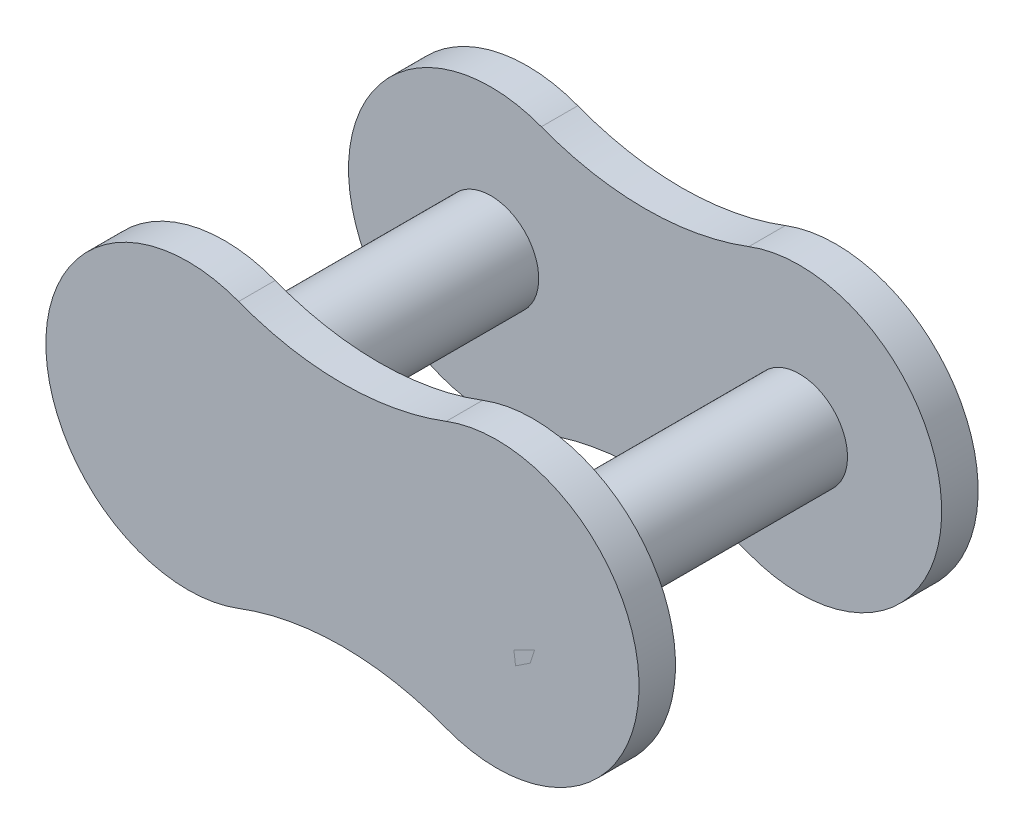
ISO-10303-21;
HEADER;
FILE_DESCRIPTION(('STEP AP214'),'2;1');
FILE_NAME('part.step','',(''),(''),'','','');
FILE_SCHEMA(('AUTOMOTIVE_DESIGN { 1 0 10303 214 1 1 1 1 }'));
ENDSEC;
DATA;
#1=APPLICATION_CONTEXT('core data for automotive mechanical design processes');
#2=APPLICATION_PROTOCOL_DEFINITION('international standard','automotive_design',2000,#1);
#3=PRODUCT_CONTEXT('',#1,'mechanical');
#4=PRODUCT('Part','Part','',(#3));
#5=PRODUCT_RELATED_PRODUCT_CATEGORY('part','',(#4));
#6=PRODUCT_DEFINITION_FORMATION('','',#4);
#7=PRODUCT_DEFINITION_CONTEXT('part definition',#1,'design');
#8=PRODUCT_DEFINITION('design','',#6,#7);
#9=PRODUCT_DEFINITION_SHAPE('','',#8);
#10=(LENGTH_UNIT() NAMED_UNIT(*) SI_UNIT(.MILLI.,.METRE.));
#11=(NAMED_UNIT(*) PLANE_ANGLE_UNIT() SI_UNIT($,.RADIAN.));
#12=(NAMED_UNIT(*) SI_UNIT($,.STERADIAN.) SOLID_ANGLE_UNIT());
#13=UNCERTAINTY_MEASURE_WITH_UNIT(LENGTH_MEASURE(1.E-05),#10,'distance_accuracy_value','');
#14=(GEOMETRIC_REPRESENTATION_CONTEXT(3) GLOBAL_UNCERTAINTY_ASSIGNED_CONTEXT((#13)) GLOBAL_UNIT_ASSIGNED_CONTEXT((#10,
#11,#12)) REPRESENTATION_CONTEXT('',''));
#15=CARTESIAN_POINT('',(0.,0.,0.));
#16=DIRECTION('',(0.,0.,1.));
#17=DIRECTION('',(1.,0.,0.));
#18=AXIS2_PLACEMENT_3D('',#15,#16,#17);
#19=CARTESIAN_POINT('',(12.7,0.,19.5361435713737));
#20=DIRECTION('',(0.,0.,-1.));
#21=DIRECTION('',(-1.,0.,0.));
#22=AXIS2_PLACEMENT_3D('',#19,#20,#21);
#23=CYLINDRICAL_SURFACE('',#22,1.975);
#24=CARTESIAN_POINT('',(12.7,0.,13.95));
#25=DIRECTION('',(0.,0.,-1.));
#26=DIRECTION('',(-1.,0.,0.));
#27=AXIS2_PLACEMENT_3D('',#24,#25,#26);
#28=CIRCLE('',#27,1.975);
#29=CARTESIAN_POINT('',(10.725,0.,13.95));
#30=VERTEX_POINT('',#29);
#31=EDGE_CURVE('E11',#30,#30,#28,.F.);
#32=ORIENTED_EDGE('',*,*,#31,.F.);
#33=EDGE_LOOP('',(#32));
#34=FACE_BOUND('',#33,.T.);
#35=CARTESIAN_POINT('',(12.7,0.,0.));
#36=DIRECTION('',(0.,0.,-1.));
#37=DIRECTION('',(-1.,0.,0.));
#38=AXIS2_PLACEMENT_3D('',#35,#36,#37);
#39=CIRCLE('',#38,1.975);
#40=CARTESIAN_POINT('',(10.725,0.,0.));
#41=VERTEX_POINT('',#40);
#42=EDGE_CURVE('E45',#41,#41,#39,.T.);
#43=ORIENTED_EDGE('',*,*,#42,.F.);
#44=EDGE_LOOP('',(#43));
#45=FACE_BOUND('',#44,.T.);
#46=ADVANCED_FACE('F39',(#34,#45),#23,.T.);
#47=CARTESIAN_POINT('',(12.7,0.,0.));
#48=DIRECTION('',(0.,0.,-1.));
#49=DIRECTION('',(-1.,0.,0.));
#50=AXIS2_PLACEMENT_3D('',#47,#48,#49);
#51=PLANE('',#50);
#52=ORIENTED_EDGE('',*,*,#42,.T.);
#53=EDGE_LOOP('',(#52));
#54=FACE_BOUND('',#53,.T.);
#55=ADVANCED_FACE('F51',(#54),#51,.T.);
#56=CARTESIAN_POINT('',(9.525,8.3411629884567,13.95));
#57=DIRECTION('',(0.,0.,-1.));
#58=DIRECTION('',(1.,0.,0.));
#59=AXIS2_PLACEMENT_3D('',#56,#57,#58);
#60=PLANE('',#59);
#61=ORIENTED_EDGE('',*,*,#31,.T.);
#62=EDGE_LOOP('',(#61));
#63=FACE_BOUND('',#62,.T.);
#64=ADVANCED_FACE('F58',(#63),#60,.F.);
#65=CLOSED_SHELL('',(#46,#55,#64));
#66=MANIFOLD_SOLID_BREP('B2',#65);
#67=CARTESIAN_POINT('',(0.,0.,19.5361435713737));
#68=DIRECTION('',(0.,0.,-1.));
#69=DIRECTION('',(-1.,0.,0.));
#70=AXIS2_PLACEMENT_3D('',#67,#68,#69);
#71=CYLINDRICAL_SURFACE('',#70,1.975);
#72=CARTESIAN_POINT('',(0.,0.,13.95));
#73=DIRECTION('',(0.,0.,-1.));
#74=DIRECTION('',(-1.,0.,0.));
#75=AXIS2_PLACEMENT_3D('',#72,#73,#74);
#76=CIRCLE('',#75,1.975);
#77=CARTESIAN_POINT('',(-1.975,0.,13.95));
#78=VERTEX_POINT('',#77);
#79=EDGE_CURVE('E38',#78,#78,#76,.F.);
#80=ORIENTED_EDGE('',*,*,#79,.F.);
#81=EDGE_LOOP('',(#80));
#82=FACE_BOUND('',#81,.T.);
#83=CARTESIAN_POINT('',(0.,0.,0.));
#84=DIRECTION('',(0.,0.,-1.));
#85=DIRECTION('',(-1.,0.,0.));
#86=AXIS2_PLACEMENT_3D('',#83,#84,#85);
#87=CIRCLE('',#86,1.975);
#88=CARTESIAN_POINT('',(-1.975,0.,0.));
#89=VERTEX_POINT('',#88);
#90=EDGE_CURVE('E95',#89,#89,#87,.T.);
#91=ORIENTED_EDGE('',*,*,#90,.F.);
#92=EDGE_LOOP('',(#91));
#93=FACE_BOUND('',#92,.T.);
#94=ADVANCED_FACE('F89',(#82,#93),#71,.T.);
#95=CARTESIAN_POINT('',(0.,0.,0.));
#96=DIRECTION('',(0.,0.,-1.));
#97=DIRECTION('',(-1.,0.,0.));
#98=AXIS2_PLACEMENT_3D('',#95,#96,#97);
#99=PLANE('',#98);
#100=ORIENTED_EDGE('',*,*,#90,.T.);
#101=EDGE_LOOP('',(#100));
#102=FACE_BOUND('',#101,.T.);
#103=ADVANCED_FACE('F101',(#102),#99,.T.);
#104=CARTESIAN_POINT('',(9.525,8.3411629884567,13.95));
#105=DIRECTION('',(0.,0.,-1.));
#106=DIRECTION('',(1.,0.,0.));
#107=AXIS2_PLACEMENT_3D('',#104,#105,#106);
#108=PLANE('',#107);
#109=ORIENTED_EDGE('',*,*,#79,.T.);
#110=EDGE_LOOP('',(#109));
#111=FACE_BOUND('',#110,.T.);
#112=ADVANCED_FACE('F108',(#111),#108,.F.);
#113=CLOSED_SHELL('',(#94,#103,#112));
#114=MANIFOLD_SOLID_BREP('B6',#113);
#115=CARTESIAN_POINT('',(6.35,16.6823259769134,12.45));
#116=DIRECTION('',(0.,0.,1.));
#117=DIRECTION('',(-1.,0.,0.));
#118=AXIS2_PLACEMENT_3D('',#115,#116,#117);
#119=CYLINDRICAL_SURFACE('',#118,12.);
#120=CARTESIAN_POINT('',(6.35,16.6823259769134,13.95));
#121=DIRECTION('',(0.,0.,-1.));
#122=DIRECTION('',(1.,0.,0.));
#123=AXIS2_PLACEMENT_3D('',#120,#121,#122);
#124=CIRCLE('',#123,12.);
#125=CARTESIAN_POINT('',(10.6189075630252,5.46731691680355,13.95));
#126=VERTEX_POINT('',#125);
#127=CARTESIAN_POINT('',(2.08109243697479,5.46731691680355,13.95));
#128=VERTEX_POINT('',#127);
#129=EDGE_CURVE('E201',#126,#128,#124,.T.);
#130=ORIENTED_EDGE('',*,*,#129,.F.);
#131=DIRECTION('',(0.,0.,1.));
#132=VECTOR('',#131,1.);
#133=CARTESIAN_POINT('',(10.6189075630252,5.46731691680355,12.45));
#134=LINE('',#133,#132);
#135=CARTESIAN_POINT('',(10.6189075630252,5.46731691680355,12.45));
#136=VERTEX_POINT('',#135);
#137=EDGE_CURVE('E200',#136,#126,#134,.T.);
#138=ORIENTED_EDGE('',*,*,#137,.F.);
#139=CARTESIAN_POINT('',(6.35,16.6823259769134,12.45));
#140=DIRECTION('',(0.,0.,-1.));
#141=DIRECTION('',(1.,0.,0.));
#142=AXIS2_PLACEMENT_3D('',#139,#140,#141);
#143=CIRCLE('',#142,12.);
#144=CARTESIAN_POINT('',(2.08109243697479,5.46731691680355,12.45));
#145=VERTEX_POINT('',#144);
#146=EDGE_CURVE('E195',#136,#145,#143,.T.);
#147=ORIENTED_EDGE('',*,*,#146,.T.);
#148=DIRECTION('',(0.,0.,1.));
#149=VECTOR('',#148,1.);
#150=CARTESIAN_POINT('',(2.08109243697479,5.46731691680355,12.45));
#151=LINE('',#150,#149);
#152=EDGE_CURVE('E87',#145,#128,#151,.T.);
#153=ORIENTED_EDGE('',*,*,#152,.T.);
#154=EDGE_LOOP('',(#130,#138,#147,#153));
#155=FACE_BOUND('',#154,.T.);
#156=ADVANCED_FACE('F138',(#155),#119,.F.);
#157=CARTESIAN_POINT('',(0.,0.,12.45));
#158=DIRECTION('',(0.,0.,1.));
#159=DIRECTION('',(-1.,0.,0.));
#160=AXIS2_PLACEMENT_3D('',#157,#158,#159);
#161=CYLINDRICAL_SURFACE('',#160,5.85);
#162=CARTESIAN_POINT('',(0.,0.,13.95));
#163=DIRECTION('',(0.,0.,1.));
#164=DIRECTION('',(1.,0.,0.));
#165=AXIS2_PLACEMENT_3D('',#162,#163,#164);
#166=CIRCLE('',#165,5.85);
#167=CARTESIAN_POINT('',(2.08109243697479,-5.46731691680355,13.95));
#168=VERTEX_POINT('',#167);
#169=EDGE_CURVE('E203',#128,#168,#166,.T.);
#170=ORIENTED_EDGE('',*,*,#169,.F.);
#171=ORIENTED_EDGE('',*,*,#152,.F.);
#172=CARTESIAN_POINT('',(0.,0.,12.45));
#173=DIRECTION('',(0.,0.,1.));
#174=DIRECTION('',(1.,0.,0.));
#175=AXIS2_PLACEMENT_3D('',#172,#173,#174);
#176=CIRCLE('',#175,5.85);
#177=CARTESIAN_POINT('',(2.08109243697479,-5.46731691680355,12.45));
#178=VERTEX_POINT('',#177);
#179=EDGE_CURVE('E179',#145,#178,#176,.T.);
#180=ORIENTED_EDGE('',*,*,#179,.T.);
#181=DIRECTION('',(0.,0.,1.));
#182=VECTOR('',#181,1.);
#183=CARTESIAN_POINT('',(2.08109243697479,-5.46731691680355,12.45));
#184=LINE('',#183,#182);
#185=EDGE_CURVE('E146',#178,#168,#184,.T.);
#186=ORIENTED_EDGE('',*,*,#185,.T.);
#187=EDGE_LOOP('',(#170,#171,#180,#186));
#188=FACE_BOUND('',#187,.T.);
#189=ADVANCED_FACE('F193',(#188),#161,.T.);
#190=CARTESIAN_POINT('',(6.35,-16.6823259769134,12.45));
#191=DIRECTION('',(0.,0.,1.));
#192=DIRECTION('',(-1.,0.,0.));
#193=AXIS2_PLACEMENT_3D('',#190,#191,#192);
#194=CYLINDRICAL_SURFACE('',#193,12.);
#195=CARTESIAN_POINT('',(6.35,-16.6823259769134,13.95));
#196=DIRECTION('',(0.,0.,-1.));
#197=DIRECTION('',(-1.,0.,0.));
#198=AXIS2_PLACEMENT_3D('',#195,#196,#197);
#199=CIRCLE('',#198,12.);
#200=CARTESIAN_POINT('',(10.6189075630252,-5.46731691680355,13.95));
#201=VERTEX_POINT('',#200);
#202=EDGE_CURVE('E189',#168,#201,#199,.T.);
#203=ORIENTED_EDGE('',*,*,#202,.F.);
#204=ORIENTED_EDGE('',*,*,#185,.F.);
#205=CARTESIAN_POINT('',(6.35,-16.6823259769134,12.45));
#206=DIRECTION('',(0.,0.,-1.));
#207=DIRECTION('',(-1.,0.,0.));
#208=AXIS2_PLACEMENT_3D('',#205,#206,#207);
#209=CIRCLE('',#208,12.);
#210=CARTESIAN_POINT('',(10.6189075630252,-5.46731691680355,12.45));
#211=VERTEX_POINT('',#210);
#212=EDGE_CURVE('E182',#178,#211,#209,.T.);
#213=ORIENTED_EDGE('',*,*,#212,.T.);
#214=DIRECTION('',(0.,0.,1.));
#215=VECTOR('',#214,1.);
#216=CARTESIAN_POINT('',(10.6189075630252,-5.46731691680355,12.45));
#217=LINE('',#216,#215);
#218=EDGE_CURVE('E192',#211,#201,#217,.T.);
#219=ORIENTED_EDGE('',*,*,#218,.T.);
#220=EDGE_LOOP('',(#203,#204,#213,#219));
#221=FACE_BOUND('',#220,.T.);
#222=ADVANCED_FACE('F188',(#221),#194,.F.);
#223=CARTESIAN_POINT('',(12.7,0.,12.45));
#224=DIRECTION('',(0.,0.,1.));
#225=DIRECTION('',(-1.,0.,0.));
#226=AXIS2_PLACEMENT_3D('',#223,#224,#225);
#227=CYLINDRICAL_SURFACE('',#226,5.85);
#228=CARTESIAN_POINT('',(12.7,0.,13.95));
#229=DIRECTION('',(0.,0.,1.));
#230=DIRECTION('',(1.,0.,0.));
#231=AXIS2_PLACEMENT_3D('',#228,#229,#230);
#232=CIRCLE('',#231,5.85);
#233=EDGE_CURVE('E168',#201,#126,#232,.T.);
#234=ORIENTED_EDGE('',*,*,#233,.F.);
#235=ORIENTED_EDGE('',*,*,#218,.F.);
#236=CARTESIAN_POINT('',(12.7,0.,12.45));
#237=DIRECTION('',(0.,0.,1.));
#238=DIRECTION('',(1.,0.,0.));
#239=AXIS2_PLACEMENT_3D('',#236,#237,#238);
#240=CIRCLE('',#239,5.85);
#241=EDGE_CURVE('E154',#211,#136,#240,.T.);
#242=ORIENTED_EDGE('',*,*,#241,.T.);
#243=ORIENTED_EDGE('',*,*,#137,.T.);
#244=EDGE_LOOP('',(#234,#235,#242,#243));
#245=FACE_BOUND('',#244,.T.);
#246=ADVANCED_FACE('F212',(#245),#227,.T.);
#247=CARTESIAN_POINT('',(9.525,8.3411629884567,12.45));
#248=DIRECTION('',(0.,0.,-1.));
#249=DIRECTION('',(1.,0.,0.));
#250=AXIS2_PLACEMENT_3D('',#247,#248,#249);
#251=PLANE('',#250);
#252=ORIENTED_EDGE('',*,*,#146,.F.);
#253=ORIENTED_EDGE('',*,*,#241,.F.);
#254=ORIENTED_EDGE('',*,*,#212,.F.);
#255=ORIENTED_EDGE('',*,*,#179,.F.);
#256=EDGE_LOOP('',(#252,#253,#254,#255));
#257=FACE_BOUND('',#256,.T.);
#258=ADVANCED_FACE('F184',(#257),#251,.T.);
#259=CARTESIAN_POINT('',(9.525,8.3411629884567,13.95));
#260=DIRECTION('',(0.,0.,-1.));
#261=DIRECTION('',(1.,0.,0.));
#262=AXIS2_PLACEMENT_3D('',#259,#260,#261);
#263=PLANE('',#262);
#264=ORIENTED_EDGE('',*,*,#129,.T.);
#265=ORIENTED_EDGE('',*,*,#169,.T.);
#266=ORIENTED_EDGE('',*,*,#202,.T.);
#267=ORIENTED_EDGE('',*,*,#233,.T.);
#268=EDGE_LOOP('',(#264,#265,#266,#267));
#269=FACE_BOUND('',#268,.T.);
#270=ADVANCED_FACE('F208',(#269),#263,.F.);
#271=CLOSED_SHELL('',(#156,#189,#222,#246,#258,#270));
#272=MANIFOLD_SOLID_BREP('B33',#271);
#273=CARTESIAN_POINT('',(6.35,16.6823259769134,1.5));
#274=DIRECTION('',(0.,0.,-1.));
#275=DIRECTION('',(-1.,0.,0.));
#276=AXIS2_PLACEMENT_3D('',#273,#274,#275);
#277=CYLINDRICAL_SURFACE('',#276,12.);
#278=CARTESIAN_POINT('',(6.35,16.6823259769134,0.));
#279=DIRECTION('',(0.,0.,-1.));
#280=DIRECTION('',(1.,0.,0.));
#281=AXIS2_PLACEMENT_3D('',#278,#279,#280);
#282=CIRCLE('',#281,12.);
#283=CARTESIAN_POINT('',(10.6189075630252,5.46731691680355,0.));
#284=VERTEX_POINT('',#283);
#285=CARTESIAN_POINT('',(2.08109243697479,5.46731691680355,0.));
#286=VERTEX_POINT('',#285);
#287=EDGE_CURVE('E324',#284,#286,#282,.T.);
#288=ORIENTED_EDGE('',*,*,#287,.T.);
#289=DIRECTION('',(0.,0.,-1.));
#290=VECTOR('',#289,1.);
#291=CARTESIAN_POINT('',(2.08109243697479,5.46731691680355,1.5));
#292=LINE('',#291,#290);
#293=CARTESIAN_POINT('',(2.08109243697479,5.46731691680355,1.5));
#294=VERTEX_POINT('',#293);
#295=EDGE_CURVE('E136',#294,#286,#292,.T.);
#296=ORIENTED_EDGE('',*,*,#295,.F.);
#297=CARTESIAN_POINT('',(6.35,16.6823259769134,1.5));
#298=DIRECTION('',(0.,0.,-1.));
#299=DIRECTION('',(1.,0.,0.));
#300=AXIS2_PLACEMENT_3D('',#297,#298,#299);
#301=CIRCLE('',#300,12.);
#302=CARTESIAN_POINT('',(10.6189075630252,5.46731691680355,1.5));
#303=VERTEX_POINT('',#302);
#304=EDGE_CURVE('E312',#303,#294,#301,.T.);
#305=ORIENTED_EDGE('',*,*,#304,.F.);
#306=DIRECTION('',(0.,0.,-1.));
#307=VECTOR('',#306,1.);
#308=CARTESIAN_POINT('',(10.6189075630252,5.46731691680355,1.5));
#309=LINE('',#308,#307);
#310=EDGE_CURVE('E320',#303,#284,#309,.T.);
#311=ORIENTED_EDGE('',*,*,#310,.T.);
#312=EDGE_LOOP('',(#288,#296,#305,#311));
#313=FACE_BOUND('',#312,.T.);
#314=ADVANCED_FACE('F261',(#313),#277,.F.);
#315=CARTESIAN_POINT('',(0.,0.,1.5));
#316=DIRECTION('',(0.,0.,-1.));
#317=DIRECTION('',(-1.,0.,0.));
#318=AXIS2_PLACEMENT_3D('',#315,#316,#317);
#319=CYLINDRICAL_SURFACE('',#318,5.85);
#320=CARTESIAN_POINT('',(0.,0.,0.));
#321=DIRECTION('',(0.,0.,1.));
#322=DIRECTION('',(1.,0.,0.));
#323=AXIS2_PLACEMENT_3D('',#320,#321,#322);
#324=CIRCLE('',#323,5.85);
#325=CARTESIAN_POINT('',(2.08109243697479,-5.46731691680355,0.));
#326=VERTEX_POINT('',#325);
#327=EDGE_CURVE('E316',#286,#326,#324,.T.);
#328=ORIENTED_EDGE('',*,*,#327,.T.);
#329=DIRECTION('',(0.,0.,-1.));
#330=VECTOR('',#329,1.);
#331=CARTESIAN_POINT('',(2.08109243697479,-5.46731691680355,1.5));
#332=LINE('',#331,#330);
#333=CARTESIAN_POINT('',(2.08109243697479,-5.46731691680355,1.5));
#334=VERTEX_POINT('',#333);
#335=EDGE_CURVE('E269',#334,#326,#332,.T.);
#336=ORIENTED_EDGE('',*,*,#335,.F.);
#337=CARTESIAN_POINT('',(0.,0.,1.5));
#338=DIRECTION('',(0.,0.,1.));
#339=DIRECTION('',(1.,0.,0.));
#340=AXIS2_PLACEMENT_3D('',#337,#338,#339);
#341=CIRCLE('',#340,5.85);
#342=EDGE_CURVE('E307',#294,#334,#341,.T.);
#343=ORIENTED_EDGE('',*,*,#342,.F.);
#344=ORIENTED_EDGE('',*,*,#295,.T.);
#345=EDGE_LOOP('',(#328,#336,#343,#344));
#346=FACE_BOUND('',#345,.T.);
#347=ADVANCED_FACE('F315',(#346),#319,.T.);
#348=CARTESIAN_POINT('',(6.35,-16.6823259769134,1.5));
#349=DIRECTION('',(0.,0.,-1.));
#350=DIRECTION('',(-1.,0.,0.));
#351=AXIS2_PLACEMENT_3D('',#348,#349,#350);
#352=CYLINDRICAL_SURFACE('',#351,12.);
#353=CARTESIAN_POINT('',(6.35,-16.6823259769134,0.));
#354=DIRECTION('',(0.,0.,-1.));
#355=DIRECTION('',(-1.,0.,0.));
#356=AXIS2_PLACEMENT_3D('',#353,#354,#355);
#357=CIRCLE('',#356,12.);
#358=CARTESIAN_POINT('',(10.6189075630252,-5.46731691680355,0.));
#359=VERTEX_POINT('',#358);
#360=EDGE_CURVE('E294',#326,#359,#357,.T.);
#361=ORIENTED_EDGE('',*,*,#360,.T.);
#362=DIRECTION('',(0.,0.,-1.));
#363=VECTOR('',#362,1.);
#364=CARTESIAN_POINT('',(10.6189075630252,-5.46731691680355,1.5));
#365=LINE('',#364,#363);
#366=CARTESIAN_POINT('',(10.6189075630252,-5.46731691680355,1.5));
#367=VERTEX_POINT('',#366);
#368=EDGE_CURVE('E317',#367,#359,#365,.T.);
#369=ORIENTED_EDGE('',*,*,#368,.F.);
#370=CARTESIAN_POINT('',(6.35,-16.6823259769134,1.5));
#371=DIRECTION('',(0.,0.,-1.));
#372=DIRECTION('',(-1.,0.,0.));
#373=AXIS2_PLACEMENT_3D('',#370,#371,#372);
#374=CIRCLE('',#373,12.);
#375=EDGE_CURVE('E310',#334,#367,#374,.T.);
#376=ORIENTED_EDGE('',*,*,#375,.F.);
#377=ORIENTED_EDGE('',*,*,#335,.T.);
#378=EDGE_LOOP('',(#361,#369,#376,#377));
#379=FACE_BOUND('',#378,.T.);
#380=ADVANCED_FACE('F318',(#379),#352,.F.);
#381=CARTESIAN_POINT('',(12.7,0.,1.5));
#382=DIRECTION('',(0.,0.,-1.));
#383=DIRECTION('',(-1.,0.,0.));
#384=AXIS2_PLACEMENT_3D('',#381,#382,#383);
#385=CYLINDRICAL_SURFACE('',#384,5.85);
#386=CARTESIAN_POINT('',(12.7,0.,0.));
#387=DIRECTION('',(0.,0.,1.));
#388=DIRECTION('',(1.,0.,0.));
#389=AXIS2_PLACEMENT_3D('',#386,#387,#388);
#390=CIRCLE('',#389,5.85);
#391=EDGE_CURVE('E300',#359,#284,#390,.T.);
#392=ORIENTED_EDGE('',*,*,#391,.T.);
#393=ORIENTED_EDGE('',*,*,#310,.F.);
#394=CARTESIAN_POINT('',(12.7,0.,1.5));
#395=DIRECTION('',(0.,0.,1.));
#396=DIRECTION('',(1.,0.,0.));
#397=AXIS2_PLACEMENT_3D('',#394,#395,#396);
#398=CIRCLE('',#397,5.85);
#399=EDGE_CURVE('E277',#367,#303,#398,.T.);
#400=ORIENTED_EDGE('',*,*,#399,.F.);
#401=ORIENTED_EDGE('',*,*,#368,.T.);
#402=EDGE_LOOP('',(#392,#393,#400,#401));
#403=FACE_BOUND('',#402,.T.);
#404=ADVANCED_FACE('F331',(#403),#385,.T.);
#405=CARTESIAN_POINT('',(9.525,8.3411629884567,1.5));
#406=DIRECTION('',(0.,0.,1.));
#407=DIRECTION('',(1.,0.,0.));
#408=AXIS2_PLACEMENT_3D('',#405,#406,#407);
#409=PLANE('',#408);
#410=ORIENTED_EDGE('',*,*,#304,.T.);
#411=ORIENTED_EDGE('',*,*,#342,.T.);
#412=ORIENTED_EDGE('',*,*,#375,.T.);
#413=ORIENTED_EDGE('',*,*,#399,.T.);
#414=EDGE_LOOP('',(#410,#411,#412,#413));
#415=FACE_BOUND('',#414,.T.);
#416=ADVANCED_FACE('F308',(#415),#409,.T.);
#417=CARTESIAN_POINT('',(9.525,8.3411629884567,0.));
#418=DIRECTION('',(0.,0.,1.));
#419=DIRECTION('',(1.,0.,0.));
#420=AXIS2_PLACEMENT_3D('',#417,#418,#419);
#421=PLANE('',#420);
#422=ORIENTED_EDGE('',*,*,#287,.F.);
#423=ORIENTED_EDGE('',*,*,#391,.F.);
#424=ORIENTED_EDGE('',*,*,#360,.F.);
#425=ORIENTED_EDGE('',*,*,#327,.F.);
#426=EDGE_LOOP('',(#422,#423,#424,#425));
#427=FACE_BOUND('',#426,.T.);
#428=ADVANCED_FACE('F334',(#427),#421,.F.);
#429=CLOSED_SHELL('',(#314,#347,#380,#404,#416,#428));
#430=MANIFOLD_SOLID_BREP('B81',#429);
#431=ADVANCED_BREP_SHAPE_REPRESENTATION('',(#18,#66,#114,#272,#430),#14);
#432=SHAPE_DEFINITION_REPRESENTATION(#9,#431);
ENDSEC;
END-ISO-10303-21;
